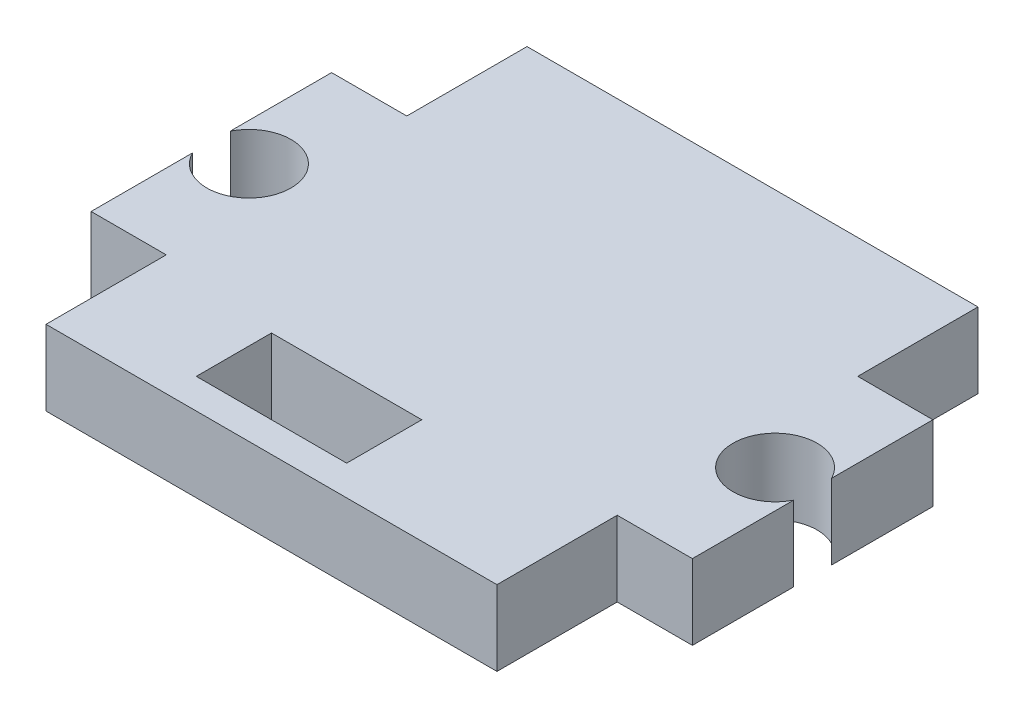
ISO-10303-21;
HEADER;
FILE_DESCRIPTION(('STEP AP214'),'2;1');
FILE_NAME('part.step','',(''),(''),'','','');
FILE_SCHEMA(('AUTOMOTIVE_DESIGN { 1 0 10303 214 1 1 1 1 }'));
ENDSEC;
DATA;
#1=APPLICATION_CONTEXT('core data for automotive mechanical design processes');
#2=APPLICATION_PROTOCOL_DEFINITION('international standard','automotive_design',2000,#1);
#3=PRODUCT_CONTEXT('',#1,'mechanical');
#4=PRODUCT('Part','Part','',(#3));
#5=PRODUCT_RELATED_PRODUCT_CATEGORY('part','',(#4));
#6=PRODUCT_DEFINITION_FORMATION('','',#4);
#7=PRODUCT_DEFINITION_CONTEXT('part definition',#1,'design');
#8=PRODUCT_DEFINITION('design','',#6,#7);
#9=PRODUCT_DEFINITION_SHAPE('','',#8);
#10=(LENGTH_UNIT() NAMED_UNIT(*) SI_UNIT(.MILLI.,.METRE.));
#11=(NAMED_UNIT(*) PLANE_ANGLE_UNIT() SI_UNIT($,.RADIAN.));
#12=(NAMED_UNIT(*) SI_UNIT($,.STERADIAN.) SOLID_ANGLE_UNIT());
#13=UNCERTAINTY_MEASURE_WITH_UNIT(LENGTH_MEASURE(1.E-05),#10,'distance_accuracy_value','');
#14=(GEOMETRIC_REPRESENTATION_CONTEXT(3) GLOBAL_UNCERTAINTY_ASSIGNED_CONTEXT((#13)) GLOBAL_UNIT_ASSIGNED_CONTEXT((#10,
#11,#12)) REPRESENTATION_CONTEXT('',''));
#15=CARTESIAN_POINT('',(0.,0.,0.));
#16=DIRECTION('',(0.,0.,1.));
#17=DIRECTION('',(1.,0.,0.));
#18=AXIS2_PLACEMENT_3D('',#15,#16,#17);
#19=CARTESIAN_POINT('',(25.4,3.175,0.));
#20=DIRECTION('',(-1.,0.,0.));
#21=DIRECTION('',(0.,0.,1.));
#22=AXIS2_PLACEMENT_3D('',#19,#20,#21);
#23=PLANE('',#22);
#24=DIRECTION('',(0.,0.,-1.));
#25=VECTOR('',#24,1.);
#26=CARTESIAN_POINT('',(25.4,0.,0.));
#27=LINE('',#26,#25);
#28=CARTESIAN_POINT('',(25.4,0.,15.24));
#29=VERTEX_POINT('',#28);
#30=CARTESIAN_POINT('',(25.4,0.,10.9607045335203));
#31=VERTEX_POINT('',#30);
#32=EDGE_CURVE('E322',#29,#31,#27,.T.);
#33=ORIENTED_EDGE('',*,*,#32,.T.);
#34=DIRECTION('',(0.,1.,0.));
#35=VECTOR('',#34,1.);
#36=CARTESIAN_POINT('',(25.4,0.,10.9607045335203));
#37=LINE('',#36,#35);
#38=CARTESIAN_POINT('',(25.4,3.175,10.9607045335203));
#39=VERTEX_POINT('',#38);
#40=EDGE_CURVE('E215',#31,#39,#37,.T.);
#41=ORIENTED_EDGE('',*,*,#40,.T.);
#42=DIRECTION('',(0.,0.,-1.));
#43=VECTOR('',#42,1.);
#44=CARTESIAN_POINT('',(25.4,3.175,0.));
#45=LINE('',#44,#43);
#46=CARTESIAN_POINT('',(25.4,3.175,15.24));
#47=VERTEX_POINT('',#46);
#48=EDGE_CURVE('E310',#47,#39,#45,.T.);
#49=ORIENTED_EDGE('',*,*,#48,.F.);
#50=DIRECTION('',(0.,1.,0.));
#51=VECTOR('',#50,1.);
#52=CARTESIAN_POINT('',(25.4,0.,15.24));
#53=LINE('',#52,#51);
#54=EDGE_CURVE('E234',#29,#47,#53,.T.);
#55=ORIENTED_EDGE('',*,*,#54,.F.);
#56=EDGE_LOOP('',(#33,#41,#49,#55));
#57=FACE_BOUND('',#56,.T.);
#58=ADVANCED_FACE('F37',(#57),#23,.F.);
#59=CARTESIAN_POINT('',(0.,3.175,0.));
#60=DIRECTION('',(1.,0.,0.));
#61=DIRECTION('',(0.,0.,-1.));
#62=AXIS2_PLACEMENT_3D('',#59,#60,#61);
#63=PLANE('',#62);
#64=DIRECTION('',(0.,0.,1.));
#65=VECTOR('',#64,1.);
#66=CARTESIAN_POINT('',(0.,0.,0.));
#67=LINE('',#66,#65);
#68=CARTESIAN_POINT('',(0.,0.,5.08));
#69=VERTEX_POINT('',#68);
#70=CARTESIAN_POINT('',(0.,0.,9.35929546647968));
#71=VERTEX_POINT('',#70);
#72=EDGE_CURVE('E315',#69,#71,#67,.T.);
#73=ORIENTED_EDGE('',*,*,#72,.T.);
#74=DIRECTION('',(0.,1.,0.));
#75=VECTOR('',#74,1.);
#76=CARTESIAN_POINT('',(0.,0.,9.35929546647968));
#77=LINE('',#76,#75);
#78=CARTESIAN_POINT('',(0.,3.175,9.35929546647968));
#79=VERTEX_POINT('',#78);
#80=EDGE_CURVE('E223',#71,#79,#77,.T.);
#81=ORIENTED_EDGE('',*,*,#80,.T.);
#82=DIRECTION('',(0.,0.,1.));
#83=VECTOR('',#82,1.);
#84=CARTESIAN_POINT('',(0.,3.175,0.));
#85=LINE('',#84,#83);
#86=CARTESIAN_POINT('',(0.,3.175,5.08));
#87=VERTEX_POINT('',#86);
#88=EDGE_CURVE('E302',#87,#79,#85,.T.);
#89=ORIENTED_EDGE('',*,*,#88,.F.);
#90=DIRECTION('',(0.,1.,0.));
#91=VECTOR('',#90,1.);
#92=CARTESIAN_POINT('',(0.,0.,5.08));
#93=LINE('',#92,#91);
#94=EDGE_CURVE('E290',#69,#87,#93,.T.);
#95=ORIENTED_EDGE('',*,*,#94,.F.);
#96=EDGE_LOOP('',(#73,#81,#89,#95));
#97=FACE_BOUND('',#96,.T.);
#98=ADVANCED_FACE('F333',(#97),#63,.F.);
#99=CARTESIAN_POINT('',(0.,3.175,10.9607045335203));
#100=VERTEX_POINT('',#99);
#101=CARTESIAN_POINT('',(0.,3.175,15.24));
#102=VERTEX_POINT('',#101);
#103=EDGE_CURVE('E306',#100,#102,#85,.T.);
#104=ORIENTED_EDGE('',*,*,#103,.F.);
#105=DIRECTION('',(0.,1.,0.));
#106=VECTOR('',#105,1.);
#107=CARTESIAN_POINT('',(0.,0.,10.9607045335203));
#108=LINE('',#107,#106);
#109=CARTESIAN_POINT('',(0.,0.,10.9607045335203));
#110=VERTEX_POINT('',#109);
#111=EDGE_CURVE('E220',#100,#110,#108,.F.);
#112=ORIENTED_EDGE('',*,*,#111,.T.);
#113=CARTESIAN_POINT('',(0.,0.,15.24));
#114=VERTEX_POINT('',#113);
#115=EDGE_CURVE('E298',#110,#114,#67,.T.);
#116=ORIENTED_EDGE('',*,*,#115,.T.);
#117=DIRECTION('',(0.,1.,0.));
#118=VECTOR('',#117,1.);
#119=CARTESIAN_POINT('',(0.,0.,15.24));
#120=LINE('',#119,#118);
#121=EDGE_CURVE('E276',#114,#102,#120,.T.);
#122=ORIENTED_EDGE('',*,*,#121,.T.);
#123=EDGE_LOOP('',(#104,#112,#116,#122));
#124=FACE_BOUND('',#123,.T.);
#125=ADVANCED_FACE('F39',(#124),#63,.F.);
#126=CARTESIAN_POINT('',(0.,3.175,20.32));
#127=DIRECTION('',(0.,0.,-1.));
#128=DIRECTION('',(-1.,0.,0.));
#129=AXIS2_PLACEMENT_3D('',#126,#127,#128);
#130=PLANE('',#129);
#131=DIRECTION('',(1.,0.,0.));
#132=VECTOR('',#131,1.);
#133=CARTESIAN_POINT('',(0.,0.,20.32));
#134=LINE('',#133,#132);
#135=CARTESIAN_POINT('',(3.175,0.,20.32));
#136=VERTEX_POINT('',#135);
#137=CARTESIAN_POINT('',(22.225,0.,20.32));
#138=VERTEX_POINT('',#137);
#139=EDGE_CURVE('E318',#136,#138,#134,.T.);
#140=ORIENTED_EDGE('',*,*,#139,.T.);
#141=DIRECTION('',(0.,1.,0.));
#142=VECTOR('',#141,1.);
#143=CARTESIAN_POINT('',(22.225,0.,20.32));
#144=LINE('',#143,#142);
#145=CARTESIAN_POINT('',(22.225,3.175,20.32));
#146=VERTEX_POINT('',#145);
#147=EDGE_CURVE('E238',#138,#146,#144,.T.);
#148=ORIENTED_EDGE('',*,*,#147,.T.);
#149=DIRECTION('',(1.,0.,0.));
#150=VECTOR('',#149,1.);
#151=CARTESIAN_POINT('',(0.,3.175,20.32));
#152=LINE('',#151,#150);
#153=CARTESIAN_POINT('',(3.175,3.175,20.32));
#154=VERTEX_POINT('',#153);
#155=EDGE_CURVE('E305',#154,#146,#152,.T.);
#156=ORIENTED_EDGE('',*,*,#155,.F.);
#157=DIRECTION('',(0.,1.,0.));
#158=VECTOR('',#157,1.);
#159=CARTESIAN_POINT('',(3.175,0.,20.32));
#160=LINE('',#159,#158);
#161=EDGE_CURVE('E271',#136,#154,#160,.T.);
#162=ORIENTED_EDGE('',*,*,#161,.F.);
#163=EDGE_LOOP('',(#140,#148,#156,#162));
#164=FACE_BOUND('',#163,.T.);
#165=ADVANCED_FACE('F378',(#164),#130,.F.);
#166=CARTESIAN_POINT('',(25.4,3.175,9.35929546647967));
#167=VERTEX_POINT('',#166);
#168=CARTESIAN_POINT('',(25.4,3.175,5.08));
#169=VERTEX_POINT('',#168);
#170=EDGE_CURVE('E309',#167,#169,#45,.T.);
#171=ORIENTED_EDGE('',*,*,#170,.F.);
#172=DIRECTION('',(0.,1.,0.));
#173=VECTOR('',#172,1.);
#174=CARTESIAN_POINT('',(25.4,0.,9.35929546647967));
#175=LINE('',#174,#173);
#176=CARTESIAN_POINT('',(25.4,0.,9.35929546647967));
#177=VERTEX_POINT('',#176);
#178=EDGE_CURVE('E212',#167,#177,#175,.F.);
#179=ORIENTED_EDGE('',*,*,#178,.T.);
#180=CARTESIAN_POINT('',(25.4,0.,5.08));
#181=VERTEX_POINT('',#180);
#182=EDGE_CURVE('E321',#177,#181,#27,.T.);
#183=ORIENTED_EDGE('',*,*,#182,.T.);
#184=DIRECTION('',(0.,1.,0.));
#185=VECTOR('',#184,1.);
#186=CARTESIAN_POINT('',(25.4,0.,5.08));
#187=LINE('',#186,#185);
#188=EDGE_CURVE('E257',#181,#169,#187,.T.);
#189=ORIENTED_EDGE('',*,*,#188,.T.);
#190=EDGE_LOOP('',(#171,#179,#183,#189));
#191=FACE_BOUND('',#190,.T.);
#192=ADVANCED_FACE('F362',(#191),#23,.F.);
#193=CARTESIAN_POINT('',(0.,3.175,0.));
#194=DIRECTION('',(0.,0.,1.));
#195=DIRECTION('',(1.,0.,0.));
#196=AXIS2_PLACEMENT_3D('',#193,#194,#195);
#197=PLANE('',#196);
#198=DIRECTION('',(-1.,0.,0.));
#199=VECTOR('',#198,1.);
#200=CARTESIAN_POINT('',(0.,3.175,0.));
#201=LINE('',#200,#199);
#202=CARTESIAN_POINT('',(22.225,3.175,0.));
#203=VERTEX_POINT('',#202);
#204=CARTESIAN_POINT('',(3.175,3.175,0.));
#205=VERTEX_POINT('',#204);
#206=EDGE_CURVE('E313',#203,#205,#201,.T.);
#207=ORIENTED_EDGE('',*,*,#206,.F.);
#208=DIRECTION('',(0.,1.,0.));
#209=VECTOR('',#208,1.);
#210=CARTESIAN_POINT('',(22.225,0.,0.));
#211=LINE('',#210,#209);
#212=CARTESIAN_POINT('',(22.225,0.,0.));
#213=VERTEX_POINT('',#212);
#214=EDGE_CURVE('E252',#213,#203,#211,.T.);
#215=ORIENTED_EDGE('',*,*,#214,.F.);
#216=DIRECTION('',(-1.,0.,0.));
#217=VECTOR('',#216,1.);
#218=CARTESIAN_POINT('',(0.,0.,0.));
#219=LINE('',#218,#217);
#220=CARTESIAN_POINT('',(3.175,0.,0.));
#221=VERTEX_POINT('',#220);
#222=EDGE_CURVE('E325',#213,#221,#219,.T.);
#223=ORIENTED_EDGE('',*,*,#222,.T.);
#224=DIRECTION('',(0.,1.,0.));
#225=VECTOR('',#224,1.);
#226=CARTESIAN_POINT('',(3.175,0.,0.));
#227=LINE('',#226,#225);
#228=EDGE_CURVE('E295',#221,#205,#227,.T.);
#229=ORIENTED_EDGE('',*,*,#228,.T.);
#230=EDGE_LOOP('',(#207,#215,#223,#229));
#231=FACE_BOUND('',#230,.T.);
#232=ADVANCED_FACE('F350',(#231),#197,.F.);
#233=CARTESIAN_POINT('',(0.,3.175,0.));
#234=DIRECTION('',(0.,1.,0.));
#235=DIRECTION('',(0.,0.,1.));
#236=AXIS2_PLACEMENT_3D('',#233,#234,#235);
#237=PLANE('',#236);
#238=DIRECTION('',(0.,0.,1.));
#239=VECTOR('',#238,1.);
#240=CARTESIAN_POINT('',(8.255,3.175,15.875));
#241=LINE('',#240,#239);
#242=CARTESIAN_POINT('',(8.255,3.175,15.875));
#243=VERTEX_POINT('',#242);
#244=CARTESIAN_POINT('',(8.255,3.175,19.05));
#245=VERTEX_POINT('',#244);
#246=EDGE_CURVE('E52',#243,#245,#241,.T.);
#247=ORIENTED_EDGE('',*,*,#246,.F.);
#248=DIRECTION('',(-1.,0.,0.));
#249=VECTOR('',#248,1.);
#250=CARTESIAN_POINT('',(8.255,3.175,15.875));
#251=LINE('',#250,#249);
#252=CARTESIAN_POINT('',(14.605,3.175,15.875));
#253=VERTEX_POINT('',#252);
#254=EDGE_CURVE('E192',#253,#243,#251,.T.);
#255=ORIENTED_EDGE('',*,*,#254,.F.);
#256=DIRECTION('',(0.,0.,-1.));
#257=VECTOR('',#256,1.);
#258=CARTESIAN_POINT('',(14.605,3.175,15.875));
#259=LINE('',#258,#257);
#260=CARTESIAN_POINT('',(14.605,3.175,19.05));
#261=VERTEX_POINT('',#260);
#262=EDGE_CURVE('E195',#261,#253,#259,.T.);
#263=ORIENTED_EDGE('',*,*,#262,.F.);
#264=DIRECTION('',(1.,0.,0.));
#265=VECTOR('',#264,1.);
#266=CARTESIAN_POINT('',(8.255,3.175,19.05));
#267=LINE('',#266,#265);
#268=EDGE_CURVE('E201',#245,#261,#267,.T.);
#269=ORIENTED_EDGE('',*,*,#268,.F.);
#270=EDGE_LOOP('',(#247,#255,#263,#269));
#271=FACE_BOUND('',#270,.T.);
#272=CARTESIAN_POINT('',(23.8125,3.175,10.16));
#273=DIRECTION('',(0.,1.,0.));
#274=DIRECTION('',(0.,0.,1.));
#275=AXIS2_PLACEMENT_3D('',#272,#273,#274);
#276=CIRCLE('',#275,1.778);
#277=EDGE_CURVE('E207',#167,#39,#276,.T.);
#278=ORIENTED_EDGE('',*,*,#277,.F.);
#279=ORIENTED_EDGE('',*,*,#170,.T.);
#280=DIRECTION('',(1.,0.,0.));
#281=VECTOR('',#280,1.);
#282=CARTESIAN_POINT('',(25.4,3.175,5.08));
#283=LINE('',#282,#281);
#284=CARTESIAN_POINT('',(22.225,3.175,5.08));
#285=VERTEX_POINT('',#284);
#286=EDGE_CURVE('E249',#285,#169,#283,.T.);
#287=ORIENTED_EDGE('',*,*,#286,.F.);
#288=DIRECTION('',(0.,0.,1.));
#289=VECTOR('',#288,1.);
#290=CARTESIAN_POINT('',(22.225,3.175,0.));
#291=LINE('',#290,#289);
#292=EDGE_CURVE('E241',#203,#285,#291,.T.);
#293=ORIENTED_EDGE('',*,*,#292,.F.);
#294=ORIENTED_EDGE('',*,*,#206,.T.);
#295=DIRECTION('',(0.,0.,-1.));
#296=VECTOR('',#295,1.);
#297=CARTESIAN_POINT('',(3.175,3.175,0.));
#298=LINE('',#297,#296);
#299=CARTESIAN_POINT('',(3.175,3.175,5.08));
#300=VERTEX_POINT('',#299);
#301=EDGE_CURVE('E287',#300,#205,#298,.T.);
#302=ORIENTED_EDGE('',*,*,#301,.F.);
#303=DIRECTION('',(1.,0.,0.));
#304=VECTOR('',#303,1.);
#305=CARTESIAN_POINT('',(0.,3.175,5.08));
#306=LINE('',#305,#304);
#307=EDGE_CURVE('E279',#87,#300,#306,.T.);
#308=ORIENTED_EDGE('',*,*,#307,.F.);
#309=ORIENTED_EDGE('',*,*,#88,.T.);
#310=CARTESIAN_POINT('',(1.5875,3.175,10.16));
#311=DIRECTION('',(0.,1.,0.));
#312=DIRECTION('',(0.,0.,1.));
#313=AXIS2_PLACEMENT_3D('',#310,#311,#312);
#314=CIRCLE('',#313,1.778);
#315=EDGE_CURVE('E218',#100,#79,#314,.T.);
#316=ORIENTED_EDGE('',*,*,#315,.F.);
#317=ORIENTED_EDGE('',*,*,#103,.T.);
#318=DIRECTION('',(-1.,0.,0.));
#319=VECTOR('',#318,1.);
#320=CARTESIAN_POINT('',(0.,3.175,15.24));
#321=LINE('',#320,#319);
#322=CARTESIAN_POINT('',(3.175,3.175,15.24));
#323=VERTEX_POINT('',#322);
#324=EDGE_CURVE('E268',#323,#102,#321,.T.);
#325=ORIENTED_EDGE('',*,*,#324,.F.);
#326=DIRECTION('',(0.,0.,-1.));
#327=VECTOR('',#326,1.);
#328=CARTESIAN_POINT('',(3.175,3.175,20.32));
#329=LINE('',#328,#327);
#330=EDGE_CURVE('E260',#154,#323,#329,.T.);
#331=ORIENTED_EDGE('',*,*,#330,.F.);
#332=ORIENTED_EDGE('',*,*,#155,.T.);
#333=DIRECTION('',(0.,0.,1.));
#334=VECTOR('',#333,1.);
#335=CARTESIAN_POINT('',(22.225,3.175,20.32));
#336=LINE('',#335,#334);
#337=CARTESIAN_POINT('',(22.225,3.175,15.24));
#338=VERTEX_POINT('',#337);
#339=EDGE_CURVE('E231',#338,#146,#336,.T.);
#340=ORIENTED_EDGE('',*,*,#339,.F.);
#341=DIRECTION('',(-1.,0.,0.));
#342=VECTOR('',#341,1.);
#343=CARTESIAN_POINT('',(25.4,3.175,15.24));
#344=LINE('',#343,#342);
#345=EDGE_CURVE('E226',#47,#338,#344,.T.);
#346=ORIENTED_EDGE('',*,*,#345,.F.);
#347=ORIENTED_EDGE('',*,*,#48,.T.);
#348=EDGE_LOOP('',(#278,#279,#287,#293,#294,#302,#308,#309,#316,#317,#325,#331,#332,#340,#346,#347));
#349=FACE_BOUND('',#348,.T.);
#350=ADVANCED_FACE('F342',(#271,#349),#237,.T.);
#351=CARTESIAN_POINT('',(0.,0.,0.));
#352=DIRECTION('',(0.,1.,0.));
#353=DIRECTION('',(0.,0.,1.));
#354=AXIS2_PLACEMENT_3D('',#351,#352,#353);
#355=PLANE('',#354);
#356=DIRECTION('',(-1.,0.,0.));
#357=VECTOR('',#356,1.);
#358=CARTESIAN_POINT('',(8.255,0.,15.875));
#359=LINE('',#358,#357);
#360=CARTESIAN_POINT('',(14.605,0.,15.875));
#361=VERTEX_POINT('',#360);
#362=CARTESIAN_POINT('',(8.255,0.,15.875));
#363=VERTEX_POINT('',#362);
#364=EDGE_CURVE('E182',#361,#363,#359,.T.);
#365=ORIENTED_EDGE('',*,*,#364,.T.);
#366=DIRECTION('',(0.,0.,1.));
#367=VECTOR('',#366,1.);
#368=CARTESIAN_POINT('',(8.255,0.,15.875));
#369=LINE('',#368,#367);
#370=CARTESIAN_POINT('',(8.255,0.,19.05));
#371=VERTEX_POINT('',#370);
#372=EDGE_CURVE('E176',#363,#371,#369,.T.);
#373=ORIENTED_EDGE('',*,*,#372,.T.);
#374=DIRECTION('',(1.,0.,0.));
#375=VECTOR('',#374,1.);
#376=CARTESIAN_POINT('',(8.255,0.,19.05));
#377=LINE('',#376,#375);
#378=CARTESIAN_POINT('',(14.605,0.,19.05));
#379=VERTEX_POINT('',#378);
#380=EDGE_CURVE('E185',#371,#379,#377,.T.);
#381=ORIENTED_EDGE('',*,*,#380,.T.);
#382=DIRECTION('',(0.,0.,-1.));
#383=VECTOR('',#382,1.);
#384=CARTESIAN_POINT('',(14.605,0.,15.875));
#385=LINE('',#384,#383);
#386=EDGE_CURVE('E60',#379,#361,#385,.T.);
#387=ORIENTED_EDGE('',*,*,#386,.T.);
#388=EDGE_LOOP('',(#365,#373,#381,#387));
#389=FACE_BOUND('',#388,.T.);
#390=ORIENTED_EDGE('',*,*,#182,.F.);
#391=CARTESIAN_POINT('',(23.8125,0.,10.16));
#392=DIRECTION('',(0.,1.,0.));
#393=DIRECTION('',(0.,0.,1.));
#394=AXIS2_PLACEMENT_3D('',#391,#392,#393);
#395=CIRCLE('',#394,1.778);
#396=EDGE_CURVE('E11',#177,#31,#395,.T.);
#397=ORIENTED_EDGE('',*,*,#396,.T.);
#398=ORIENTED_EDGE('',*,*,#32,.F.);
#399=DIRECTION('',(-1.,0.,0.));
#400=VECTOR('',#399,1.);
#401=CARTESIAN_POINT('',(25.4,0.,15.24));
#402=LINE('',#401,#400);
#403=CARTESIAN_POINT('',(22.225,0.,15.24));
#404=VERTEX_POINT('',#403);
#405=EDGE_CURVE('E227',#29,#404,#402,.T.);
#406=ORIENTED_EDGE('',*,*,#405,.T.);
#407=DIRECTION('',(0.,0.,1.));
#408=VECTOR('',#407,1.);
#409=CARTESIAN_POINT('',(22.225,0.,20.32));
#410=LINE('',#409,#408);
#411=EDGE_CURVE('E230',#404,#138,#410,.T.);
#412=ORIENTED_EDGE('',*,*,#411,.T.);
#413=ORIENTED_EDGE('',*,*,#139,.F.);
#414=DIRECTION('',(0.,0.,-1.));
#415=VECTOR('',#414,1.);
#416=CARTESIAN_POINT('',(3.175,0.,20.32));
#417=LINE('',#416,#415);
#418=CARTESIAN_POINT('',(3.175,0.,15.24));
#419=VERTEX_POINT('',#418);
#420=EDGE_CURVE('E264',#136,#419,#417,.T.);
#421=ORIENTED_EDGE('',*,*,#420,.T.);
#422=DIRECTION('',(-1.,0.,0.));
#423=VECTOR('',#422,1.);
#424=CARTESIAN_POINT('',(0.,0.,15.24));
#425=LINE('',#424,#423);
#426=EDGE_CURVE('E267',#419,#114,#425,.T.);
#427=ORIENTED_EDGE('',*,*,#426,.T.);
#428=ORIENTED_EDGE('',*,*,#115,.F.);
#429=CARTESIAN_POINT('',(1.5875,0.,10.16));
#430=DIRECTION('',(0.,1.,0.));
#431=DIRECTION('',(0.,0.,1.));
#432=AXIS2_PLACEMENT_3D('',#429,#430,#431);
#433=CIRCLE('',#432,1.778);
#434=EDGE_CURVE('E45',#110,#71,#433,.T.);
#435=ORIENTED_EDGE('',*,*,#434,.T.);
#436=ORIENTED_EDGE('',*,*,#72,.F.);
#437=DIRECTION('',(1.,0.,0.));
#438=VECTOR('',#437,1.);
#439=CARTESIAN_POINT('',(0.,0.,5.08));
#440=LINE('',#439,#438);
#441=CARTESIAN_POINT('',(3.175,0.,5.08));
#442=VERTEX_POINT('',#441);
#443=EDGE_CURVE('E283',#69,#442,#440,.T.);
#444=ORIENTED_EDGE('',*,*,#443,.T.);
#445=DIRECTION('',(0.,0.,-1.));
#446=VECTOR('',#445,1.);
#447=CARTESIAN_POINT('',(3.175,0.,0.));
#448=LINE('',#447,#446);
#449=EDGE_CURVE('E286',#442,#221,#448,.T.);
#450=ORIENTED_EDGE('',*,*,#449,.T.);
#451=ORIENTED_EDGE('',*,*,#222,.F.);
#452=DIRECTION('',(0.,0.,1.));
#453=VECTOR('',#452,1.);
#454=CARTESIAN_POINT('',(22.225,0.,0.));
#455=LINE('',#454,#453);
#456=CARTESIAN_POINT('',(22.225,0.,5.08));
#457=VERTEX_POINT('',#456);
#458=EDGE_CURVE('E245',#213,#457,#455,.T.);
#459=ORIENTED_EDGE('',*,*,#458,.T.);
#460=DIRECTION('',(1.,0.,0.));
#461=VECTOR('',#460,1.);
#462=CARTESIAN_POINT('',(25.4,0.,5.08));
#463=LINE('',#462,#461);
#464=EDGE_CURVE('E248',#457,#181,#463,.T.);
#465=ORIENTED_EDGE('',*,*,#464,.T.);
#466=EDGE_LOOP('',(#390,#397,#398,#406,#412,#413,#421,#427,#428,#435,#436,#444,#450,#451,#459,#465));
#467=FACE_BOUND('',#466,.T.);
#468=ADVANCED_FACE('F189',(#389,#467),#355,.F.);
#469=CARTESIAN_POINT('',(3.175,0.,0.));
#470=DIRECTION('',(1.,0.,0.));
#471=DIRECTION('',(0.,0.,-1.));
#472=AXIS2_PLACEMENT_3D('',#469,#470,#471);
#473=PLANE('',#472);
#474=ORIENTED_EDGE('',*,*,#301,.T.);
#475=ORIENTED_EDGE('',*,*,#228,.F.);
#476=ORIENTED_EDGE('',*,*,#449,.F.);
#477=DIRECTION('',(0.,1.,0.));
#478=VECTOR('',#477,1.);
#479=CARTESIAN_POINT('',(3.175,0.,5.08));
#480=LINE('',#479,#478);
#481=EDGE_CURVE('E299',#442,#300,#480,.T.);
#482=ORIENTED_EDGE('',*,*,#481,.T.);
#483=EDGE_LOOP('',(#474,#475,#476,#482));
#484=FACE_BOUND('',#483,.T.);
#485=ADVANCED_FACE('F348',(#484),#473,.F.);
#486=CARTESIAN_POINT('',(0.,0.,5.08));
#487=DIRECTION('',(0.,0.,1.));
#488=DIRECTION('',(1.,0.,0.));
#489=AXIS2_PLACEMENT_3D('',#486,#487,#488);
#490=PLANE('',#489);
#491=ORIENTED_EDGE('',*,*,#307,.T.);
#492=ORIENTED_EDGE('',*,*,#481,.F.);
#493=ORIENTED_EDGE('',*,*,#443,.F.);
#494=ORIENTED_EDGE('',*,*,#94,.T.);
#495=EDGE_LOOP('',(#491,#492,#493,#494));
#496=FACE_BOUND('',#495,.T.);
#497=ADVANCED_FACE('F337',(#496),#490,.F.);
#498=CARTESIAN_POINT('',(0.,0.,15.24));
#499=DIRECTION('',(0.,0.,-1.));
#500=DIRECTION('',(-1.,0.,0.));
#501=AXIS2_PLACEMENT_3D('',#498,#499,#500);
#502=PLANE('',#501);
#503=ORIENTED_EDGE('',*,*,#324,.T.);
#504=ORIENTED_EDGE('',*,*,#121,.F.);
#505=ORIENTED_EDGE('',*,*,#426,.F.);
#506=DIRECTION('',(0.,1.,0.));
#507=VECTOR('',#506,1.);
#508=CARTESIAN_POINT('',(3.175,0.,15.24));
#509=LINE('',#508,#507);
#510=EDGE_CURVE('E280',#419,#323,#509,.T.);
#511=ORIENTED_EDGE('',*,*,#510,.T.);
#512=EDGE_LOOP('',(#503,#504,#505,#511));
#513=FACE_BOUND('',#512,.T.);
#514=ADVANCED_FACE('F386',(#513),#502,.F.);
#515=CARTESIAN_POINT('',(3.175,0.,20.32));
#516=DIRECTION('',(1.,0.,0.));
#517=DIRECTION('',(0.,0.,-1.));
#518=AXIS2_PLACEMENT_3D('',#515,#516,#517);
#519=PLANE('',#518);
#520=ORIENTED_EDGE('',*,*,#330,.T.);
#521=ORIENTED_EDGE('',*,*,#510,.F.);
#522=ORIENTED_EDGE('',*,*,#420,.F.);
#523=ORIENTED_EDGE('',*,*,#161,.T.);
#524=EDGE_LOOP('',(#520,#521,#522,#523));
#525=FACE_BOUND('',#524,.T.);
#526=ADVANCED_FACE('F383',(#525),#519,.F.);
#527=CARTESIAN_POINT('',(25.4,0.,5.08));
#528=DIRECTION('',(0.,0.,1.));
#529=DIRECTION('',(1.,0.,0.));
#530=AXIS2_PLACEMENT_3D('',#527,#528,#529);
#531=PLANE('',#530);
#532=ORIENTED_EDGE('',*,*,#286,.T.);
#533=ORIENTED_EDGE('',*,*,#188,.F.);
#534=ORIENTED_EDGE('',*,*,#464,.F.);
#535=DIRECTION('',(0.,1.,0.));
#536=VECTOR('',#535,1.);
#537=CARTESIAN_POINT('',(22.225,0.,5.08));
#538=LINE('',#537,#536);
#539=EDGE_CURVE('E261',#457,#285,#538,.T.);
#540=ORIENTED_EDGE('',*,*,#539,.T.);
#541=EDGE_LOOP('',(#532,#533,#534,#540));
#542=FACE_BOUND('',#541,.T.);
#543=ADVANCED_FACE('F358',(#542),#531,.F.);
#544=CARTESIAN_POINT('',(22.225,0.,0.));
#545=DIRECTION('',(-1.,0.,0.));
#546=DIRECTION('',(0.,0.,1.));
#547=AXIS2_PLACEMENT_3D('',#544,#545,#546);
#548=PLANE('',#547);
#549=ORIENTED_EDGE('',*,*,#292,.T.);
#550=ORIENTED_EDGE('',*,*,#539,.F.);
#551=ORIENTED_EDGE('',*,*,#458,.F.);
#552=ORIENTED_EDGE('',*,*,#214,.T.);
#553=EDGE_LOOP('',(#549,#550,#551,#552));
#554=FACE_BOUND('',#553,.T.);
#555=ADVANCED_FACE('F355',(#554),#548,.F.);
#556=CARTESIAN_POINT('',(22.225,0.,20.32));
#557=DIRECTION('',(-1.,0.,0.));
#558=DIRECTION('',(0.,0.,1.));
#559=AXIS2_PLACEMENT_3D('',#556,#557,#558);
#560=PLANE('',#559);
#561=ORIENTED_EDGE('',*,*,#339,.T.);
#562=ORIENTED_EDGE('',*,*,#147,.F.);
#563=ORIENTED_EDGE('',*,*,#411,.F.);
#564=DIRECTION('',(0.,1.,0.));
#565=VECTOR('',#564,1.);
#566=CARTESIAN_POINT('',(22.225,0.,15.24));
#567=LINE('',#566,#565);
#568=EDGE_CURVE('E242',#404,#338,#567,.T.);
#569=ORIENTED_EDGE('',*,*,#568,.T.);
#570=EDGE_LOOP('',(#561,#562,#563,#569));
#571=FACE_BOUND('',#570,.T.);
#572=ADVANCED_FACE('F376',(#571),#560,.F.);
#573=CARTESIAN_POINT('',(25.4,0.,15.24));
#574=DIRECTION('',(0.,0.,-1.));
#575=DIRECTION('',(-1.,0.,0.));
#576=AXIS2_PLACEMENT_3D('',#573,#574,#575);
#577=PLANE('',#576);
#578=ORIENTED_EDGE('',*,*,#345,.T.);
#579=ORIENTED_EDGE('',*,*,#568,.F.);
#580=ORIENTED_EDGE('',*,*,#405,.F.);
#581=ORIENTED_EDGE('',*,*,#54,.T.);
#582=EDGE_LOOP('',(#578,#579,#580,#581));
#583=FACE_BOUND('',#582,.T.);
#584=ADVANCED_FACE('F370',(#583),#577,.F.);
#585=CARTESIAN_POINT('',(1.5875,0.,10.16));
#586=DIRECTION('',(0.,1.,0.));
#587=DIRECTION('',(0.,0.,1.));
#588=AXIS2_PLACEMENT_3D('',#585,#586,#587);
#589=CYLINDRICAL_SURFACE('',#588,1.778);
#590=ORIENTED_EDGE('',*,*,#434,.F.);
#591=ORIENTED_EDGE('',*,*,#111,.F.);
#592=ORIENTED_EDGE('',*,*,#315,.T.);
#593=ORIENTED_EDGE('',*,*,#80,.F.);
#594=EDGE_LOOP('',(#590,#591,#592,#593));
#595=FACE_BOUND('',#594,.T.);
#596=ADVANCED_FACE('F390',(#595),#589,.F.);
#597=CARTESIAN_POINT('',(23.8125,0.,10.16));
#598=DIRECTION('',(0.,1.,0.));
#599=DIRECTION('',(0.,0.,1.));
#600=AXIS2_PLACEMENT_3D('',#597,#598,#599);
#601=CYLINDRICAL_SURFACE('',#600,1.778);
#602=ORIENTED_EDGE('',*,*,#396,.F.);
#603=ORIENTED_EDGE('',*,*,#178,.F.);
#604=ORIENTED_EDGE('',*,*,#277,.T.);
#605=ORIENTED_EDGE('',*,*,#40,.F.);
#606=EDGE_LOOP('',(#602,#603,#604,#605));
#607=FACE_BOUND('',#606,.T.);
#608=ADVANCED_FACE('F392',(#607),#601,.F.);
#609=CARTESIAN_POINT('',(8.255,0.,15.875));
#610=DIRECTION('',(-1.,0.,0.));
#611=DIRECTION('',(0.,0.,1.));
#612=AXIS2_PLACEMENT_3D('',#609,#610,#611);
#613=PLANE('',#612);
#614=ORIENTED_EDGE('',*,*,#246,.T.);
#615=DIRECTION('',(0.,1.,0.));
#616=VECTOR('',#615,1.);
#617=CARTESIAN_POINT('',(8.255,0.,19.05));
#618=LINE('',#617,#616);
#619=EDGE_CURVE('E172',#371,#245,#618,.T.);
#620=ORIENTED_EDGE('',*,*,#619,.F.);
#621=ORIENTED_EDGE('',*,*,#372,.F.);
#622=DIRECTION('',(0.,1.,0.));
#623=VECTOR('',#622,1.);
#624=CARTESIAN_POINT('',(8.255,0.,15.875));
#625=LINE('',#624,#623);
#626=EDGE_CURVE('E205',#363,#243,#625,.T.);
#627=ORIENTED_EDGE('',*,*,#626,.T.);
#628=EDGE_LOOP('',(#614,#620,#621,#627));
#629=FACE_BOUND('',#628,.T.);
#630=ADVANCED_FACE('F174',(#629),#613,.F.);
#631=CARTESIAN_POINT('',(8.255,0.,15.875));
#632=DIRECTION('',(0.,0.,-1.));
#633=DIRECTION('',(-1.,0.,0.));
#634=AXIS2_PLACEMENT_3D('',#631,#632,#633);
#635=PLANE('',#634);
#636=ORIENTED_EDGE('',*,*,#254,.T.);
#637=ORIENTED_EDGE('',*,*,#626,.F.);
#638=ORIENTED_EDGE('',*,*,#364,.F.);
#639=DIRECTION('',(0.,1.,0.));
#640=VECTOR('',#639,1.);
#641=CARTESIAN_POINT('',(14.605,0.,15.875));
#642=LINE('',#641,#640);
#643=EDGE_CURVE('E208',#361,#253,#642,.T.);
#644=ORIENTED_EDGE('',*,*,#643,.T.);
#645=EDGE_LOOP('',(#636,#637,#638,#644));
#646=FACE_BOUND('',#645,.T.);
#647=ADVANCED_FACE('F574',(#646),#635,.F.);
#648=CARTESIAN_POINT('',(14.605,0.,15.875));
#649=DIRECTION('',(1.,0.,0.));
#650=DIRECTION('',(0.,0.,-1.));
#651=AXIS2_PLACEMENT_3D('',#648,#649,#650);
#652=PLANE('',#651);
#653=ORIENTED_EDGE('',*,*,#262,.T.);
#654=ORIENTED_EDGE('',*,*,#643,.F.);
#655=ORIENTED_EDGE('',*,*,#386,.F.);
#656=DIRECTION('',(0.,1.,0.));
#657=VECTOR('',#656,1.);
#658=CARTESIAN_POINT('',(14.605,0.,19.05));
#659=LINE('',#658,#657);
#660=EDGE_CURVE('E181',#379,#261,#659,.T.);
#661=ORIENTED_EDGE('',*,*,#660,.T.);
#662=EDGE_LOOP('',(#653,#654,#655,#661));
#663=FACE_BOUND('',#662,.T.);
#664=ADVANCED_FACE('F567',(#663),#652,.F.);
#665=CARTESIAN_POINT('',(8.255,0.,19.05));
#666=DIRECTION('',(0.,0.,1.));
#667=DIRECTION('',(1.,0.,0.));
#668=AXIS2_PLACEMENT_3D('',#665,#666,#667);
#669=PLANE('',#668);
#670=ORIENTED_EDGE('',*,*,#268,.T.);
#671=ORIENTED_EDGE('',*,*,#660,.F.);
#672=ORIENTED_EDGE('',*,*,#380,.F.);
#673=ORIENTED_EDGE('',*,*,#619,.T.);
#674=EDGE_LOOP('',(#670,#671,#672,#673));
#675=FACE_BOUND('',#674,.T.);
#676=ADVANCED_FACE('F186',(#675),#669,.F.);
#677=CLOSED_SHELL('',(#58,#98,#125,#165,#192,#232,#350,#468,#485,#497,#514,#526,#543,#555,#572,
#584,#596,#608,#630,#647,#664,#676));
#678=MANIFOLD_SOLID_BREP('B2',#677);
#679=ADVANCED_BREP_SHAPE_REPRESENTATION('',(#18,#678),#14);
#680=SHAPE_DEFINITION_REPRESENTATION(#9,#679);
ENDSEC;
END-ISO-10303-21;
